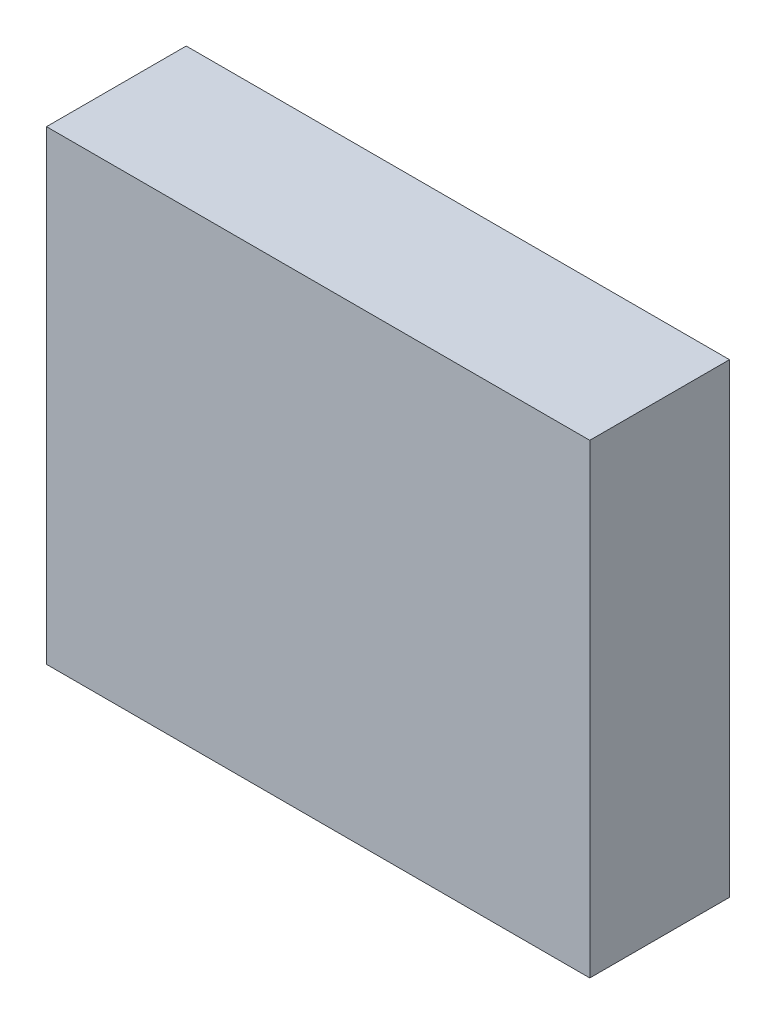
ISO-10303-21;
HEADER;
FILE_DESCRIPTION(('STEP AP214'),'2;1');
FILE_NAME('part.step','',(''),(''),'','','');
FILE_SCHEMA(('AUTOMOTIVE_DESIGN { 1 0 10303 214 1 1 1 1 }'));
ENDSEC;
DATA;
#1=APPLICATION_CONTEXT('core data for automotive mechanical design processes');
#2=APPLICATION_PROTOCOL_DEFINITION('international standard','automotive_design',2000,#1);
#3=PRODUCT_CONTEXT('',#1,'mechanical');
#4=PRODUCT('Part','Part','',(#3));
#5=PRODUCT_RELATED_PRODUCT_CATEGORY('part','',(#4));
#6=PRODUCT_DEFINITION_FORMATION('','',#4);
#7=PRODUCT_DEFINITION_CONTEXT('part definition',#1,'design');
#8=PRODUCT_DEFINITION('design','',#6,#7);
#9=PRODUCT_DEFINITION_SHAPE('','',#8);
#10=(LENGTH_UNIT() NAMED_UNIT(*) SI_UNIT(.MILLI.,.METRE.));
#11=(NAMED_UNIT(*) PLANE_ANGLE_UNIT() SI_UNIT($,.RADIAN.));
#12=(NAMED_UNIT(*) SI_UNIT($,.STERADIAN.) SOLID_ANGLE_UNIT());
#13=UNCERTAINTY_MEASURE_WITH_UNIT(LENGTH_MEASURE(1.E-05),#10,'distance_accuracy_value','');
#14=(GEOMETRIC_REPRESENTATION_CONTEXT(3) GLOBAL_UNCERTAINTY_ASSIGNED_CONTEXT((#13)) GLOBAL_UNIT_ASSIGNED_CONTEXT((#10,
#11,#12)) REPRESENTATION_CONTEXT('',''));
#15=CARTESIAN_POINT('',(0.,0.,0.));
#16=DIRECTION('',(0.,0.,1.));
#17=DIRECTION('',(1.,0.,0.));
#18=AXIS2_PLACEMENT_3D('',#15,#16,#17);
#19=CARTESIAN_POINT('',(-32.,-174.,238.5));
#20=DIRECTION('',(0.,0.,1.));
#21=DIRECTION('',(1.,0.,0.));
#22=AXIS2_PLACEMENT_3D('',#19,#20,#21);
#23=PLANE('',#22);
#24=DIRECTION('',(0.,1.,0.));
#25=VECTOR('',#24,1.);
#26=CARTESIAN_POINT('',(-32.,-174.,238.5));
#27=LINE('',#26,#25);
#28=CARTESIAN_POINT('',(-32.,-174.,238.5));
#29=VERTEX_POINT('',#28);
#30=CARTESIAN_POINT('',(-32.,-114.,238.5));
#31=VERTEX_POINT('',#30);
#32=EDGE_CURVE('E93',#29,#31,#27,.T.);
#33=ORIENTED_EDGE('',*,*,#32,.F.);
#34=DIRECTION('',(1.,0.,0.));
#35=VECTOR('',#34,1.);
#36=CARTESIAN_POINT('',(-32.,-174.,238.5));
#37=LINE('',#36,#35);
#38=CARTESIAN_POINT('',(38.,-174.,238.5));
#39=VERTEX_POINT('',#38);
#40=EDGE_CURVE('E75',#29,#39,#37,.T.);
#41=ORIENTED_EDGE('',*,*,#40,.T.);
#42=DIRECTION('',(0.,1.,0.));
#43=VECTOR('',#42,1.);
#44=CARTESIAN_POINT('',(38.,-174.,238.5));
#45=LINE('',#44,#43);
#46=CARTESIAN_POINT('',(38.,-114.,238.5));
#47=VERTEX_POINT('',#46);
#48=EDGE_CURVE('E97',#39,#47,#45,.T.);
#49=ORIENTED_EDGE('',*,*,#48,.T.);
#50=DIRECTION('',(1.,0.,0.));
#51=VECTOR('',#50,1.);
#52=CARTESIAN_POINT('',(-32.,-114.,238.5));
#53=LINE('',#52,#51);
#54=EDGE_CURVE('E9',#31,#47,#53,.T.);
#55=ORIENTED_EDGE('',*,*,#54,.F.);
#56=EDGE_LOOP('',(#33,#41,#49,#55));
#57=FACE_BOUND('',#56,.T.);
#58=ADVANCED_FACE('F14',(#57),#23,.T.);
#59=CARTESIAN_POINT('',(-32.,-174.,220.5));
#60=DIRECTION('',(0.,0.,1.));
#61=DIRECTION('',(1.,0.,0.));
#62=AXIS2_PLACEMENT_3D('',#59,#60,#61);
#63=PLANE('',#62);
#64=DIRECTION('',(1.,0.,0.));
#65=VECTOR('',#64,1.);
#66=CARTESIAN_POINT('',(-32.,-114.,220.5));
#67=LINE('',#66,#65);
#68=CARTESIAN_POINT('',(-32.,-114.,220.5));
#69=VERTEX_POINT('',#68);
#70=CARTESIAN_POINT('',(38.,-114.,220.5));
#71=VERTEX_POINT('',#70);
#72=EDGE_CURVE('E25',#69,#71,#67,.T.);
#73=ORIENTED_EDGE('',*,*,#72,.T.);
#74=DIRECTION('',(0.,1.,0.));
#75=VECTOR('',#74,1.);
#76=CARTESIAN_POINT('',(38.,-174.,220.5));
#77=LINE('',#76,#75);
#78=CARTESIAN_POINT('',(38.,-174.,220.5));
#79=VERTEX_POINT('',#78);
#80=EDGE_CURVE('E18',#79,#71,#77,.T.);
#81=ORIENTED_EDGE('',*,*,#80,.F.);
#82=DIRECTION('',(1.,0.,0.));
#83=VECTOR('',#82,1.);
#84=CARTESIAN_POINT('',(-32.,-174.,220.5));
#85=LINE('',#84,#83);
#86=CARTESIAN_POINT('',(-32.,-174.,220.5));
#87=VERTEX_POINT('',#86);
#88=EDGE_CURVE('E64',#87,#79,#85,.T.);
#89=ORIENTED_EDGE('',*,*,#88,.F.);
#90=DIRECTION('',(0.,1.,0.));
#91=VECTOR('',#90,1.);
#92=CARTESIAN_POINT('',(-32.,-174.,220.5));
#93=LINE('',#92,#91);
#94=EDGE_CURVE('E68',#87,#69,#93,.T.);
#95=ORIENTED_EDGE('',*,*,#94,.T.);
#96=EDGE_LOOP('',(#73,#81,#89,#95));
#97=FACE_BOUND('',#96,.T.);
#98=ADVANCED_FACE('F66',(#97),#63,.F.);
#99=CARTESIAN_POINT('',(-32.,-114.,220.5));
#100=DIRECTION('',(0.,1.,0.));
#101=DIRECTION('',(1.,0.,0.));
#102=AXIS2_PLACEMENT_3D('',#99,#100,#101);
#103=PLANE('',#102);
#104=ORIENTED_EDGE('',*,*,#72,.F.);
#105=DIRECTION('',(0.,0.,1.));
#106=VECTOR('',#105,1.);
#107=CARTESIAN_POINT('',(-32.,-114.,220.5));
#108=LINE('',#107,#106);
#109=EDGE_CURVE('E87',#69,#31,#108,.T.);
#110=ORIENTED_EDGE('',*,*,#109,.T.);
#111=ORIENTED_EDGE('',*,*,#54,.T.);
#112=DIRECTION('',(0.,0.,1.));
#113=VECTOR('',#112,1.);
#114=CARTESIAN_POINT('',(38.,-114.,220.5));
#115=LINE('',#114,#113);
#116=EDGE_CURVE('E98',#71,#47,#115,.T.);
#117=ORIENTED_EDGE('',*,*,#116,.F.);
#118=EDGE_LOOP('',(#104,#110,#111,#117));
#119=FACE_BOUND('',#118,.T.);
#120=ADVANCED_FACE('F103',(#119),#103,.T.);
#121=CARTESIAN_POINT('',(-32.,-174.,220.5));
#122=DIRECTION('',(0.,1.,0.));
#123=DIRECTION('',(1.,0.,0.));
#124=AXIS2_PLACEMENT_3D('',#121,#122,#123);
#125=PLANE('',#124);
#126=DIRECTION('',(0.,0.,1.));
#127=VECTOR('',#126,1.);
#128=CARTESIAN_POINT('',(38.,-174.,220.5));
#129=LINE('',#128,#127);
#130=EDGE_CURVE('E84',#79,#39,#129,.T.);
#131=ORIENTED_EDGE('',*,*,#130,.T.);
#132=ORIENTED_EDGE('',*,*,#40,.F.);
#133=DIRECTION('',(0.,0.,1.));
#134=VECTOR('',#133,1.);
#135=CARTESIAN_POINT('',(-32.,-174.,220.5));
#136=LINE('',#135,#134);
#137=EDGE_CURVE('E78',#87,#29,#136,.T.);
#138=ORIENTED_EDGE('',*,*,#137,.F.);
#139=ORIENTED_EDGE('',*,*,#88,.T.);
#140=EDGE_LOOP('',(#131,#132,#138,#139));
#141=FACE_BOUND('',#140,.T.);
#142=ADVANCED_FACE('F16',(#141),#125,.F.);
#143=CARTESIAN_POINT('',(38.,-174.,220.5));
#144=DIRECTION('',(1.,0.,0.));
#145=DIRECTION('',(0.,1.,0.));
#146=AXIS2_PLACEMENT_3D('',#143,#144,#145);
#147=PLANE('',#146);
#148=ORIENTED_EDGE('',*,*,#130,.F.);
#149=ORIENTED_EDGE('',*,*,#80,.T.);
#150=ORIENTED_EDGE('',*,*,#116,.T.);
#151=ORIENTED_EDGE('',*,*,#48,.F.);
#152=EDGE_LOOP('',(#148,#149,#150,#151));
#153=FACE_BOUND('',#152,.T.);
#154=ADVANCED_FACE('F108',(#153),#147,.T.);
#155=CARTESIAN_POINT('',(-32.,-174.,220.5));
#156=DIRECTION('',(1.,0.,0.));
#157=DIRECTION('',(0.,1.,0.));
#158=AXIS2_PLACEMENT_3D('',#155,#156,#157);
#159=PLANE('',#158);
#160=ORIENTED_EDGE('',*,*,#32,.T.);
#161=ORIENTED_EDGE('',*,*,#109,.F.);
#162=ORIENTED_EDGE('',*,*,#94,.F.);
#163=ORIENTED_EDGE('',*,*,#137,.T.);
#164=EDGE_LOOP('',(#160,#161,#162,#163));
#165=FACE_BOUND('',#164,.T.);
#166=ADVANCED_FACE('F86',(#165),#159,.F.);
#167=CLOSED_SHELL('',(#58,#98,#120,#142,#154,#166));
#168=MANIFOLD_SOLID_BREP('B1',#167);
#169=ADVANCED_BREP_SHAPE_REPRESENTATION('',(#18,#168),#14);
#170=SHAPE_DEFINITION_REPRESENTATION(#9,#169);
ENDSEC;
END-ISO-10303-21;
